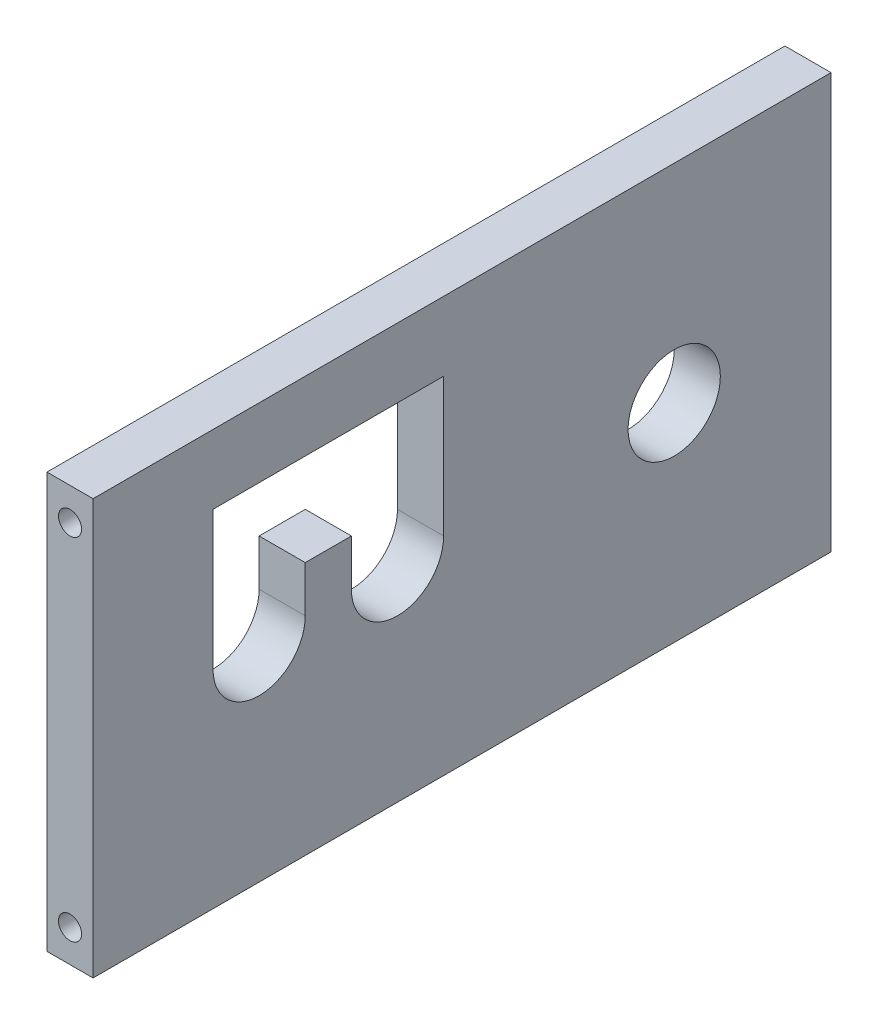
ISO-10303-21;
HEADER;
FILE_DESCRIPTION(('STEP AP214'),'2;1');
FILE_NAME('part.step','',(''),(''),'','','');
FILE_SCHEMA(('AUTOMOTIVE_DESIGN { 1 0 10303 214 1 1 1 1 }'));
ENDSEC;
DATA;
#1=APPLICATION_CONTEXT('core data for automotive mechanical design processes');
#2=APPLICATION_PROTOCOL_DEFINITION('international standard','automotive_design',2000,#1);
#3=PRODUCT_CONTEXT('',#1,'mechanical');
#4=PRODUCT('Part','Part','',(#3));
#5=PRODUCT_RELATED_PRODUCT_CATEGORY('part','',(#4));
#6=PRODUCT_DEFINITION_FORMATION('','',#4);
#7=PRODUCT_DEFINITION_CONTEXT('part definition',#1,'design');
#8=PRODUCT_DEFINITION('design','',#6,#7);
#9=PRODUCT_DEFINITION_SHAPE('','',#8);
#10=(LENGTH_UNIT() NAMED_UNIT(*) SI_UNIT(.MILLI.,.METRE.));
#11=(NAMED_UNIT(*) PLANE_ANGLE_UNIT() SI_UNIT($,.RADIAN.));
#12=(NAMED_UNIT(*) SI_UNIT($,.STERADIAN.) SOLID_ANGLE_UNIT());
#13=UNCERTAINTY_MEASURE_WITH_UNIT(LENGTH_MEASURE(1.E-05),#10,'distance_accuracy_value','');
#14=(GEOMETRIC_REPRESENTATION_CONTEXT(3) GLOBAL_UNCERTAINTY_ASSIGNED_CONTEXT((#13)) GLOBAL_UNIT_ASSIGNED_CONTEXT((#10,
#11,#12)) REPRESENTATION_CONTEXT('',''));
#15=CARTESIAN_POINT('',(0.,0.,0.));
#16=DIRECTION('',(0.,0.,1.));
#17=DIRECTION('',(1.,0.,0.));
#18=AXIS2_PLACEMENT_3D('',#15,#16,#17);
#19=CARTESIAN_POINT('',(-10.,0.,22.));
#20=DIRECTION('',(1.,0.,0.));
#21=DIRECTION('',(0.,0.,-1.));
#22=AXIS2_PLACEMENT_3D('',#19,#20,#21);
#23=CYLINDRICAL_SURFACE('',#22,5.);
#24=DIRECTION('',(1.,0.,0.));
#25=VECTOR('',#24,1.);
#26=CARTESIAN_POINT('',(-10.,0.,27.));
#27=LINE('',#26,#25);
#28=CARTESIAN_POINT('',(0.,0.,27.));
#29=VERTEX_POINT('',#28);
#30=CARTESIAN_POINT('',(-5.,0.,27.));
#31=VERTEX_POINT('',#30);
#32=EDGE_CURVE('E146',#29,#31,#27,.F.);
#33=ORIENTED_EDGE('',*,*,#32,.F.);
#34=CARTESIAN_POINT('',(0.,0.,22.));
#35=DIRECTION('',(1.,0.,0.));
#36=DIRECTION('',(0.,0.,-1.));
#37=AXIS2_PLACEMENT_3D('',#34,#35,#36);
#38=CIRCLE('',#37,5.);
#39=CARTESIAN_POINT('',(0.,0.,17.));
#40=VERTEX_POINT('',#39);
#41=EDGE_CURVE('E153',#29,#40,#38,.T.);
#42=ORIENTED_EDGE('',*,*,#41,.T.);
#43=DIRECTION('',(1.,0.,0.));
#44=VECTOR('',#43,1.);
#45=CARTESIAN_POINT('',(-10.,0.,17.));
#46=LINE('',#45,#44);
#47=CARTESIAN_POINT('',(-5.,0.,17.));
#48=VERTEX_POINT('',#47);
#49=EDGE_CURVE('E137',#40,#48,#46,.F.);
#50=ORIENTED_EDGE('',*,*,#49,.T.);
#51=CARTESIAN_POINT('',(-5.,0.,22.));
#52=DIRECTION('',(1.,0.,0.));
#53=DIRECTION('',(0.,0.,-1.));
#54=AXIS2_PLACEMENT_3D('',#51,#52,#53);
#55=CIRCLE('',#54,5.);
#56=EDGE_CURVE('E176',#31,#48,#55,.T.);
#57=ORIENTED_EDGE('',*,*,#56,.F.);
#58=EDGE_LOOP('',(#33,#42,#50,#57));
#59=FACE_BOUND('',#58,.T.);
#60=ADVANCED_FACE('F37',(#59),#23,.F.);
#61=CARTESIAN_POINT('',(-5.,22.5,40.));
#62=DIRECTION('',(0.,0.,1.));
#63=DIRECTION('',(1.,0.,0.));
#64=AXIS2_PLACEMENT_3D('',#61,#62,#63);
#65=PLANE('',#64);
#66=CARTESIAN_POINT('',(-2.5,19.,40.));
#67=DIRECTION('',(0.,0.,1.));
#68=DIRECTION('',(1.,0.,0.));
#69=AXIS2_PLACEMENT_3D('',#66,#67,#68);
#70=CIRCLE('',#69,1.24999999999999);
#71=CARTESIAN_POINT('',(-1.25000000000001,19.,40.));
#72=VERTEX_POINT('',#71);
#73=EDGE_CURVE('E190',#72,#72,#70,.T.);
#74=ORIENTED_EDGE('',*,*,#73,.F.);
#75=EDGE_LOOP('',(#74));
#76=FACE_BOUND('',#75,.T.);
#77=CARTESIAN_POINT('',(-2.5,-19.,40.));
#78=DIRECTION('',(0.,0.,1.));
#79=DIRECTION('',(1.,0.,0.));
#80=AXIS2_PLACEMENT_3D('',#77,#78,#79);
#81=CIRCLE('',#80,1.24999999999999);
#82=CARTESIAN_POINT('',(-1.25000000000001,-19.,40.));
#83=VERTEX_POINT('',#82);
#84=EDGE_CURVE('E196',#83,#83,#81,.T.);
#85=ORIENTED_EDGE('',*,*,#84,.F.);
#86=EDGE_LOOP('',(#85));
#87=FACE_BOUND('',#86,.T.);
#88=DIRECTION('',(0.,-1.,0.));
#89=VECTOR('',#88,1.);
#90=CARTESIAN_POINT('',(0.,22.5,40.));
#91=LINE('',#90,#89);
#92=CARTESIAN_POINT('',(0.,22.5,40.));
#93=VERTEX_POINT('',#92);
#94=CARTESIAN_POINT('',(0.,-22.5,40.));
#95=VERTEX_POINT('',#94);
#96=EDGE_CURVE('E202',#93,#95,#91,.T.);
#97=ORIENTED_EDGE('',*,*,#96,.F.);
#98=DIRECTION('',(1.,0.,0.));
#99=VECTOR('',#98,1.);
#100=CARTESIAN_POINT('',(-5.,22.5,40.));
#101=LINE('',#100,#99);
#102=CARTESIAN_POINT('',(-5.,22.5,40.));
#103=VERTEX_POINT('',#102);
#104=EDGE_CURVE('E147',#103,#93,#101,.T.);
#105=ORIENTED_EDGE('',*,*,#104,.F.);
#106=DIRECTION('',(0.,-1.,0.));
#107=VECTOR('',#106,1.);
#108=CARTESIAN_POINT('',(-5.,22.5,40.));
#109=LINE('',#108,#107);
#110=CARTESIAN_POINT('',(-5.,-22.5,40.));
#111=VERTEX_POINT('',#110);
#112=EDGE_CURVE('E203',#103,#111,#109,.T.);
#113=ORIENTED_EDGE('',*,*,#112,.T.);
#114=DIRECTION('',(1.,0.,0.));
#115=VECTOR('',#114,1.);
#116=CARTESIAN_POINT('',(-5.,-22.5,40.));
#117=LINE('',#116,#115);
#118=EDGE_CURVE('E214',#111,#95,#117,.T.);
#119=ORIENTED_EDGE('',*,*,#118,.T.);
#120=EDGE_LOOP('',(#97,#105,#113,#119));
#121=FACE_BOUND('',#120,.T.);
#122=ADVANCED_FACE('F39',(#76,#87,#121),#65,.T.);
#123=CARTESIAN_POINT('',(-5.,22.5,40.));
#124=DIRECTION('',(0.,-1.,0.));
#125=DIRECTION('',(0.,0.,-1.));
#126=AXIS2_PLACEMENT_3D('',#123,#124,#125);
#127=PLANE('',#126);
#128=DIRECTION('',(0.,0.,-1.));
#129=VECTOR('',#128,1.);
#130=CARTESIAN_POINT('',(0.,22.5,40.));
#131=LINE('',#130,#129);
#132=CARTESIAN_POINT('',(0.,22.5,-40.));
#133=VERTEX_POINT('',#132);
#134=EDGE_CURVE('E207',#93,#133,#131,.T.);
#135=ORIENTED_EDGE('',*,*,#134,.T.);
#136=DIRECTION('',(1.,0.,0.));
#137=VECTOR('',#136,1.);
#138=CARTESIAN_POINT('',(-5.,22.5,-40.));
#139=LINE('',#138,#137);
#140=CARTESIAN_POINT('',(-5.,22.5,-40.));
#141=VERTEX_POINT('',#140);
#142=EDGE_CURVE('E225',#141,#133,#139,.T.);
#143=ORIENTED_EDGE('',*,*,#142,.F.);
#144=DIRECTION('',(0.,0.,-1.));
#145=VECTOR('',#144,1.);
#146=CARTESIAN_POINT('',(-5.,22.5,40.));
#147=LINE('',#146,#145);
#148=EDGE_CURVE('E212',#103,#141,#147,.T.);
#149=ORIENTED_EDGE('',*,*,#148,.F.);
#150=ORIENTED_EDGE('',*,*,#104,.T.);
#151=EDGE_LOOP('',(#135,#143,#149,#150));
#152=FACE_BOUND('',#151,.T.);
#153=ADVANCED_FACE('F293',(#152),#127,.F.);
#154=CARTESIAN_POINT('',(-5.,22.5,-40.));
#155=DIRECTION('',(0.,0.,1.));
#156=DIRECTION('',(1.,0.,0.));
#157=AXIS2_PLACEMENT_3D('',#154,#155,#156);
#158=PLANE('',#157);
#159=CARTESIAN_POINT('',(-2.5,19.,-40.));
#160=DIRECTION('',(0.,0.,-1.));
#161=DIRECTION('',(-1.,0.,0.));
#162=AXIS2_PLACEMENT_3D('',#159,#160,#161);
#163=CIRCLE('',#162,1.24999999999999);
#164=CARTESIAN_POINT('',(-3.74999999999999,19.,-40.));
#165=VERTEX_POINT('',#164);
#166=EDGE_CURVE('E178',#165,#165,#163,.T.);
#167=ORIENTED_EDGE('',*,*,#166,.F.);
#168=EDGE_LOOP('',(#167));
#169=FACE_BOUND('',#168,.T.);
#170=CARTESIAN_POINT('',(-2.5,-19.,-40.));
#171=DIRECTION('',(0.,0.,-1.));
#172=DIRECTION('',(-1.,0.,0.));
#173=AXIS2_PLACEMENT_3D('',#170,#171,#172);
#174=CIRCLE('',#173,1.24999999999999);
#175=CARTESIAN_POINT('',(-3.74999999999999,-19.,-40.));
#176=VERTEX_POINT('',#175);
#177=EDGE_CURVE('E184',#176,#176,#174,.T.);
#178=ORIENTED_EDGE('',*,*,#177,.F.);
#179=EDGE_LOOP('',(#178));
#180=FACE_BOUND('',#179,.T.);
#181=DIRECTION('',(0.,-1.,0.));
#182=VECTOR('',#181,1.);
#183=CARTESIAN_POINT('',(0.,22.5,-40.));
#184=LINE('',#183,#182);
#185=CARTESIAN_POINT('',(0.,-22.5,-40.));
#186=VERTEX_POINT('',#185);
#187=EDGE_CURVE('E220',#133,#186,#184,.T.);
#188=ORIENTED_EDGE('',*,*,#187,.T.);
#189=DIRECTION('',(1.,0.,0.));
#190=VECTOR('',#189,1.);
#191=CARTESIAN_POINT('',(-5.,-22.5,-40.));
#192=LINE('',#191,#190);
#193=CARTESIAN_POINT('',(-5.,-22.5,-40.));
#194=VERTEX_POINT('',#193);
#195=EDGE_CURVE('E228',#194,#186,#192,.T.);
#196=ORIENTED_EDGE('',*,*,#195,.F.);
#197=DIRECTION('',(0.,-1.,0.));
#198=VECTOR('',#197,1.);
#199=CARTESIAN_POINT('',(-5.,22.5,-40.));
#200=LINE('',#199,#198);
#201=EDGE_CURVE('E210',#141,#194,#200,.T.);
#202=ORIENTED_EDGE('',*,*,#201,.F.);
#203=ORIENTED_EDGE('',*,*,#142,.T.);
#204=EDGE_LOOP('',(#188,#196,#202,#203));
#205=FACE_BOUND('',#204,.T.);
#206=ADVANCED_FACE('F340',(#169,#180,#205),#158,.F.);
#207=CARTESIAN_POINT('',(-5.,-22.5,40.));
#208=DIRECTION('',(0.,-1.,0.));
#209=DIRECTION('',(0.,0.,-1.));
#210=AXIS2_PLACEMENT_3D('',#207,#208,#209);
#211=PLANE('',#210);
#212=DIRECTION('',(0.,0.,-1.));
#213=VECTOR('',#212,1.);
#214=CARTESIAN_POINT('',(0.,-22.5,40.));
#215=LINE('',#214,#213);
#216=EDGE_CURVE('E217',#95,#186,#215,.T.);
#217=ORIENTED_EDGE('',*,*,#216,.F.);
#218=ORIENTED_EDGE('',*,*,#118,.F.);
#219=DIRECTION('',(0.,0.,-1.));
#220=VECTOR('',#219,1.);
#221=CARTESIAN_POINT('',(-5.,-22.5,40.));
#222=LINE('',#221,#220);
#223=EDGE_CURVE('E206',#111,#194,#222,.T.);
#224=ORIENTED_EDGE('',*,*,#223,.T.);
#225=ORIENTED_EDGE('',*,*,#195,.T.);
#226=EDGE_LOOP('',(#217,#218,#224,#225));
#227=FACE_BOUND('',#226,.T.);
#228=ADVANCED_FACE('F335',(#227),#211,.T.);
#229=CARTESIAN_POINT('',(-5.,0.,0.));
#230=DIRECTION('',(1.,0.,0.));
#231=DIRECTION('',(0.,0.,-1.));
#232=AXIS2_PLACEMENT_3D('',#229,#230,#231);
#233=PLANE('',#232);
#234=DIRECTION('',(0.,0.,1.));
#235=VECTOR('',#234,1.);
#236=CARTESIAN_POINT('',(-5.,15.,0.));
#237=LINE('',#236,#235);
#238=CARTESIAN_POINT('',(-5.,15.,2.));
#239=VERTEX_POINT('',#238);
#240=CARTESIAN_POINT('',(-5.,15.,27.));
#241=VERTEX_POINT('',#240);
#242=EDGE_CURVE('E159',#239,#241,#237,.T.);
#243=ORIENTED_EDGE('',*,*,#242,.T.);
#244=DIRECTION('',(0.,-1.,0.));
#245=VECTOR('',#244,1.);
#246=CARTESIAN_POINT('',(-5.,0.,27.));
#247=LINE('',#246,#245);
#248=EDGE_CURVE('E247',#241,#31,#247,.T.);
#249=ORIENTED_EDGE('',*,*,#248,.T.);
#250=ORIENTED_EDGE('',*,*,#56,.T.);
#251=DIRECTION('',(0.,1.,0.));
#252=VECTOR('',#251,1.);
#253=CARTESIAN_POINT('',(-5.,0.,17.));
#254=LINE('',#253,#252);
#255=CARTESIAN_POINT('',(-5.,5.,17.));
#256=VERTEX_POINT('',#255);
#257=EDGE_CURVE('E52',#48,#256,#254,.T.);
#258=ORIENTED_EDGE('',*,*,#257,.T.);
#259=DIRECTION('',(0.,0.,-1.));
#260=VECTOR('',#259,1.);
#261=CARTESIAN_POINT('',(-5.,5.,0.));
#262=LINE('',#261,#260);
#263=CARTESIAN_POINT('',(-5.,5.,12.));
#264=VERTEX_POINT('',#263);
#265=EDGE_CURVE('E165',#256,#264,#262,.T.);
#266=ORIENTED_EDGE('',*,*,#265,.T.);
#267=DIRECTION('',(0.,-1.,0.));
#268=VECTOR('',#267,1.);
#269=CARTESIAN_POINT('',(-5.,0.,12.));
#270=LINE('',#269,#268);
#271=CARTESIAN_POINT('',(-5.,0.,12.));
#272=VERTEX_POINT('',#271);
#273=EDGE_CURVE('E235',#264,#272,#270,.T.);
#274=ORIENTED_EDGE('',*,*,#273,.T.);
#275=CARTESIAN_POINT('',(-5.,0.,7.));
#276=DIRECTION('',(1.,0.,0.));
#277=DIRECTION('',(0.,0.,-1.));
#278=AXIS2_PLACEMENT_3D('',#275,#276,#277);
#279=CIRCLE('',#278,5.);
#280=CARTESIAN_POINT('',(-5.,0.,2.));
#281=VERTEX_POINT('',#280);
#282=EDGE_CURVE('E170',#272,#281,#279,.T.);
#283=ORIENTED_EDGE('',*,*,#282,.T.);
#284=DIRECTION('',(0.,1.,0.));
#285=VECTOR('',#284,1.);
#286=CARTESIAN_POINT('',(-5.,0.,2.));
#287=LINE('',#286,#285);
#288=EDGE_CURVE('E246',#281,#239,#287,.T.);
#289=ORIENTED_EDGE('',*,*,#288,.T.);
#290=EDGE_LOOP('',(#243,#249,#250,#258,#266,#274,#283,#289));
#291=FACE_BOUND('',#290,.T.);
#292=CARTESIAN_POINT('',(-5.,0.,-23.));
#293=DIRECTION('',(1.,0.,0.));
#294=DIRECTION('',(0.,0.,-1.));
#295=AXIS2_PLACEMENT_3D('',#292,#293,#294);
#296=CIRCLE('',#295,5.);
#297=CARTESIAN_POINT('',(-5.,0.,-28.));
#298=VERTEX_POINT('',#297);
#299=EDGE_CURVE('E173',#298,#298,#296,.T.);
#300=ORIENTED_EDGE('',*,*,#299,.T.);
#301=EDGE_LOOP('',(#300));
#302=FACE_BOUND('',#301,.T.);
#303=ORIENTED_EDGE('',*,*,#112,.F.);
#304=ORIENTED_EDGE('',*,*,#148,.T.);
#305=ORIENTED_EDGE('',*,*,#201,.T.);
#306=ORIENTED_EDGE('',*,*,#223,.F.);
#307=EDGE_LOOP('',(#303,#304,#305,#306));
#308=FACE_BOUND('',#307,.T.);
#309=ADVANCED_FACE('F243',(#291,#302,#308),#233,.F.);
#310=CARTESIAN_POINT('',(0.,0.,0.));
#311=DIRECTION('',(1.,0.,0.));
#312=DIRECTION('',(0.,0.,-1.));
#313=AXIS2_PLACEMENT_3D('',#310,#311,#312);
#314=PLANE('',#313);
#315=DIRECTION('',(0.,-1.,0.));
#316=VECTOR('',#315,1.);
#317=CARTESIAN_POINT('',(0.,0.,27.));
#318=LINE('',#317,#316);
#319=CARTESIAN_POINT('',(0.,15.,27.));
#320=VERTEX_POINT('',#319);
#321=EDGE_CURVE('E60',#320,#29,#318,.T.);
#322=ORIENTED_EDGE('',*,*,#321,.F.);
#323=DIRECTION('',(0.,0.,1.));
#324=VECTOR('',#323,1.);
#325=CARTESIAN_POINT('',(0.,15.,27.));
#326=LINE('',#325,#324);
#327=CARTESIAN_POINT('',(0.,15.,2.));
#328=VERTEX_POINT('',#327);
#329=EDGE_CURVE('E258',#328,#320,#326,.T.);
#330=ORIENTED_EDGE('',*,*,#329,.F.);
#331=DIRECTION('',(0.,1.,0.));
#332=VECTOR('',#331,1.);
#333=CARTESIAN_POINT('',(0.,0.,2.));
#334=LINE('',#333,#332);
#335=CARTESIAN_POINT('',(0.,0.,2.));
#336=VERTEX_POINT('',#335);
#337=EDGE_CURVE('E255',#336,#328,#334,.T.);
#338=ORIENTED_EDGE('',*,*,#337,.F.);
#339=CARTESIAN_POINT('',(0.,0.,7.));
#340=DIRECTION('',(1.,0.,0.));
#341=DIRECTION('',(0.,0.,-1.));
#342=AXIS2_PLACEMENT_3D('',#339,#340,#341);
#343=CIRCLE('',#342,5.);
#344=CARTESIAN_POINT('',(0.,0.,12.));
#345=VERTEX_POINT('',#344);
#346=EDGE_CURVE('E162',#345,#336,#343,.T.);
#347=ORIENTED_EDGE('',*,*,#346,.F.);
#348=DIRECTION('',(0.,-1.,0.));
#349=VECTOR('',#348,1.);
#350=CARTESIAN_POINT('',(0.,0.,12.));
#351=LINE('',#350,#349);
#352=CARTESIAN_POINT('',(0.,5.,12.));
#353=VERTEX_POINT('',#352);
#354=EDGE_CURVE('E237',#353,#345,#351,.T.);
#355=ORIENTED_EDGE('',*,*,#354,.F.);
#356=DIRECTION('',(0.,0.,-1.));
#357=VECTOR('',#356,1.);
#358=CARTESIAN_POINT('',(0.,5.,12.));
#359=LINE('',#358,#357);
#360=CARTESIAN_POINT('',(0.,5.,17.));
#361=VERTEX_POINT('',#360);
#362=EDGE_CURVE('E156',#361,#353,#359,.T.);
#363=ORIENTED_EDGE('',*,*,#362,.F.);
#364=DIRECTION('',(0.,1.,0.));
#365=VECTOR('',#364,1.);
#366=CARTESIAN_POINT('',(0.,0.,17.));
#367=LINE('',#366,#365);
#368=EDGE_CURVE('E140',#40,#361,#367,.T.);
#369=ORIENTED_EDGE('',*,*,#368,.F.);
#370=ORIENTED_EDGE('',*,*,#41,.F.);
#371=EDGE_LOOP('',(#322,#330,#338,#347,#355,#363,#369,#370));
#372=FACE_BOUND('',#371,.T.);
#373=CARTESIAN_POINT('',(0.,0.,-23.));
#374=DIRECTION('',(1.,0.,0.));
#375=DIRECTION('',(0.,0.,-1.));
#376=AXIS2_PLACEMENT_3D('',#373,#374,#375);
#377=CIRCLE('',#376,5.);
#378=CARTESIAN_POINT('',(0.,0.,-28.));
#379=VERTEX_POINT('',#378);
#380=EDGE_CURVE('E158',#379,#379,#377,.T.);
#381=ORIENTED_EDGE('',*,*,#380,.F.);
#382=EDGE_LOOP('',(#381));
#383=FACE_BOUND('',#382,.T.);
#384=ORIENTED_EDGE('',*,*,#96,.T.);
#385=ORIENTED_EDGE('',*,*,#216,.T.);
#386=ORIENTED_EDGE('',*,*,#187,.F.);
#387=ORIENTED_EDGE('',*,*,#134,.F.);
#388=EDGE_LOOP('',(#384,#385,#386,#387));
#389=FACE_BOUND('',#388,.T.);
#390=ADVANCED_FACE('F151',(#372,#383,#389),#314,.T.);
#391=CARTESIAN_POINT('',(-2.5,-19.,32.5));
#392=DIRECTION('',(0.,0.,1.));
#393=DIRECTION('',(1.,0.,0.));
#394=AXIS2_PLACEMENT_3D('',#391,#392,#393);
#395=CONICAL_SURFACE('',#394,1.24999999999999,1.02974425867665);
#396=CARTESIAN_POINT('',(-2.5,-19.,31.7489242262155));
#397=VERTEX_POINT('',#396);
#398=VERTEX_LOOP('',#397);
#399=FACE_BOUND('',#398,.T.);
#400=CARTESIAN_POINT('',(-2.5,-19.,32.5));
#401=DIRECTION('',(0.,0.,1.));
#402=DIRECTION('',(1.,0.,0.));
#403=AXIS2_PLACEMENT_3D('',#400,#401,#402);
#404=CIRCLE('',#403,1.24999999999999);
#405=CARTESIAN_POINT('',(-1.25000000000001,-19.,32.5));
#406=VERTEX_POINT('',#405);
#407=EDGE_CURVE('E199',#406,#406,#404,.T.);
#408=ORIENTED_EDGE('',*,*,#407,.T.);
#409=EDGE_LOOP('',(#408));
#410=FACE_BOUND('',#409,.T.);
#411=ADVANCED_FACE('F328',(#399,#410),#395,.F.);
#412=CARTESIAN_POINT('',(-2.5,-19.,40.));
#413=DIRECTION('',(0.,0.,1.));
#414=DIRECTION('',(1.,0.,0.));
#415=AXIS2_PLACEMENT_3D('',#412,#413,#414);
#416=CYLINDRICAL_SURFACE('',#415,1.24999999999999);
#417=ORIENTED_EDGE('',*,*,#407,.F.);
#418=EDGE_LOOP('',(#417));
#419=FACE_BOUND('',#418,.T.);
#420=ORIENTED_EDGE('',*,*,#84,.T.);
#421=EDGE_LOOP('',(#420));
#422=FACE_BOUND('',#421,.T.);
#423=ADVANCED_FACE('F324',(#419,#422),#416,.F.);
#424=CARTESIAN_POINT('',(-2.5,19.,32.5));
#425=DIRECTION('',(0.,0.,1.));
#426=DIRECTION('',(1.,0.,0.));
#427=AXIS2_PLACEMENT_3D('',#424,#425,#426);
#428=CONICAL_SURFACE('',#427,1.24999999999999,1.02974425867665);
#429=CARTESIAN_POINT('',(-2.5,19.,31.7489242262155));
#430=VERTEX_POINT('',#429);
#431=VERTEX_LOOP('',#430);
#432=FACE_BOUND('',#431,.T.);
#433=CARTESIAN_POINT('',(-2.5,19.,32.5));
#434=DIRECTION('',(0.,0.,1.));
#435=DIRECTION('',(1.,0.,0.));
#436=AXIS2_PLACEMENT_3D('',#433,#434,#435);
#437=CIRCLE('',#436,1.24999999999999);
#438=CARTESIAN_POINT('',(-1.25000000000001,19.,32.5));
#439=VERTEX_POINT('',#438);
#440=EDGE_CURVE('E193',#439,#439,#437,.T.);
#441=ORIENTED_EDGE('',*,*,#440,.T.);
#442=EDGE_LOOP('',(#441));
#443=FACE_BOUND('',#442,.T.);
#444=ADVANCED_FACE('F320',(#432,#443),#428,.F.);
#445=CARTESIAN_POINT('',(-2.5,19.,40.));
#446=DIRECTION('',(0.,0.,1.));
#447=DIRECTION('',(1.,0.,0.));
#448=AXIS2_PLACEMENT_3D('',#445,#446,#447);
#449=CYLINDRICAL_SURFACE('',#448,1.24999999999999);
#450=ORIENTED_EDGE('',*,*,#440,.F.);
#451=EDGE_LOOP('',(#450));
#452=FACE_BOUND('',#451,.T.);
#453=ORIENTED_EDGE('',*,*,#73,.T.);
#454=EDGE_LOOP('',(#453));
#455=FACE_BOUND('',#454,.T.);
#456=ADVANCED_FACE('F316',(#452,#455),#449,.F.);
#457=CARTESIAN_POINT('',(-2.5,-19.,-32.5));
#458=DIRECTION('',(0.,0.,-1.));
#459=DIRECTION('',(-1.,0.,0.));
#460=AXIS2_PLACEMENT_3D('',#457,#458,#459);
#461=CONICAL_SURFACE('',#460,1.24999999999999,1.02974425867665);
#462=CARTESIAN_POINT('',(-2.5,-19.,-31.7489242262155));
#463=VERTEX_POINT('',#462);
#464=VERTEX_LOOP('',#463);
#465=FACE_BOUND('',#464,.T.);
#466=CARTESIAN_POINT('',(-2.5,-19.,-32.5));
#467=DIRECTION('',(0.,0.,-1.));
#468=DIRECTION('',(-1.,0.,0.));
#469=AXIS2_PLACEMENT_3D('',#466,#467,#468);
#470=CIRCLE('',#469,1.24999999999999);
#471=CARTESIAN_POINT('',(-3.74999999999999,-19.,-32.5));
#472=VERTEX_POINT('',#471);
#473=EDGE_CURVE('E187',#472,#472,#470,.T.);
#474=ORIENTED_EDGE('',*,*,#473,.T.);
#475=EDGE_LOOP('',(#474));
#476=FACE_BOUND('',#475,.T.);
#477=ADVANCED_FACE('F312',(#465,#476),#461,.F.);
#478=CARTESIAN_POINT('',(-2.5,-19.,-40.));
#479=DIRECTION('',(0.,0.,-1.));
#480=DIRECTION('',(-1.,0.,0.));
#481=AXIS2_PLACEMENT_3D('',#478,#479,#480);
#482=CYLINDRICAL_SURFACE('',#481,1.24999999999999);
#483=ORIENTED_EDGE('',*,*,#473,.F.);
#484=EDGE_LOOP('',(#483));
#485=FACE_BOUND('',#484,.T.);
#486=ORIENTED_EDGE('',*,*,#177,.T.);
#487=EDGE_LOOP('',(#486));
#488=FACE_BOUND('',#487,.T.);
#489=ADVANCED_FACE('F308',(#485,#488),#482,.F.);
#490=CARTESIAN_POINT('',(-2.5,19.,-32.5));
#491=DIRECTION('',(0.,0.,-1.));
#492=DIRECTION('',(-1.,0.,0.));
#493=AXIS2_PLACEMENT_3D('',#490,#491,#492);
#494=CONICAL_SURFACE('',#493,1.24999999999999,1.02974425867665);
#495=CARTESIAN_POINT('',(-2.5,19.,-31.7489242262155));
#496=VERTEX_POINT('',#495);
#497=VERTEX_LOOP('',#496);
#498=FACE_BOUND('',#497,.T.);
#499=CARTESIAN_POINT('',(-2.5,19.,-32.5));
#500=DIRECTION('',(0.,0.,-1.));
#501=DIRECTION('',(-1.,0.,0.));
#502=AXIS2_PLACEMENT_3D('',#499,#500,#501);
#503=CIRCLE('',#502,1.24999999999999);
#504=CARTESIAN_POINT('',(-3.74999999999999,19.,-32.5));
#505=VERTEX_POINT('',#504);
#506=EDGE_CURVE('E181',#505,#505,#503,.T.);
#507=ORIENTED_EDGE('',*,*,#506,.T.);
#508=EDGE_LOOP('',(#507));
#509=FACE_BOUND('',#508,.T.);
#510=ADVANCED_FACE('F304',(#498,#509),#494,.F.);
#511=CARTESIAN_POINT('',(-2.5,19.,-40.));
#512=DIRECTION('',(0.,0.,-1.));
#513=DIRECTION('',(-1.,0.,0.));
#514=AXIS2_PLACEMENT_3D('',#511,#512,#513);
#515=CYLINDRICAL_SURFACE('',#514,1.24999999999999);
#516=ORIENTED_EDGE('',*,*,#506,.F.);
#517=EDGE_LOOP('',(#516));
#518=FACE_BOUND('',#517,.T.);
#519=ORIENTED_EDGE('',*,*,#166,.T.);
#520=EDGE_LOOP('',(#519));
#521=FACE_BOUND('',#520,.T.);
#522=ADVANCED_FACE('F301',(#518,#521),#515,.F.);
#523=CARTESIAN_POINT('',(-10.,0.,7.));
#524=DIRECTION('',(1.,0.,0.));
#525=DIRECTION('',(0.,0.,-1.));
#526=AXIS2_PLACEMENT_3D('',#523,#524,#525);
#527=CYLINDRICAL_SURFACE('',#526,5.);
#528=ORIENTED_EDGE('',*,*,#346,.T.);
#529=DIRECTION('',(1.,0.,0.));
#530=VECTOR('',#529,1.);
#531=CARTESIAN_POINT('',(-10.,0.,2.));
#532=LINE('',#531,#530);
#533=EDGE_CURVE('E11',#336,#281,#532,.F.);
#534=ORIENTED_EDGE('',*,*,#533,.T.);
#535=ORIENTED_EDGE('',*,*,#282,.F.);
#536=DIRECTION('',(1.,0.,0.));
#537=VECTOR('',#536,1.);
#538=CARTESIAN_POINT('',(-10.,0.,12.));
#539=LINE('',#538,#537);
#540=EDGE_CURVE('E45',#345,#272,#539,.F.);
#541=ORIENTED_EDGE('',*,*,#540,.F.);
#542=EDGE_LOOP('',(#528,#534,#535,#541));
#543=FACE_BOUND('',#542,.T.);
#544=ADVANCED_FACE('F249',(#543),#527,.F.);
#545=CARTESIAN_POINT('',(-10.,0.,-23.));
#546=DIRECTION('',(1.,0.,0.));
#547=DIRECTION('',(0.,0.,-1.));
#548=AXIS2_PLACEMENT_3D('',#545,#546,#547);
#549=CYLINDRICAL_SURFACE('',#548,5.);
#550=ORIENTED_EDGE('',*,*,#380,.T.);
#551=EDGE_LOOP('',(#550));
#552=FACE_BOUND('',#551,.T.);
#553=ORIENTED_EDGE('',*,*,#299,.F.);
#554=EDGE_LOOP('',(#553));
#555=FACE_BOUND('',#554,.T.);
#556=ADVANCED_FACE('F297',(#552,#555),#549,.F.);
#557=CARTESIAN_POINT('',(-10.,0.,12.));
#558=DIRECTION('',(0.,0.,1.));
#559=DIRECTION('',(1.,0.,0.));
#560=AXIS2_PLACEMENT_3D('',#557,#558,#559);
#561=PLANE('',#560);
#562=DIRECTION('',(1.,0.,0.));
#563=VECTOR('',#562,1.);
#564=CARTESIAN_POINT('',(-10.,5.,12.));
#565=LINE('',#564,#563);
#566=EDGE_CURVE('E270',#264,#353,#565,.T.);
#567=ORIENTED_EDGE('',*,*,#566,.T.);
#568=ORIENTED_EDGE('',*,*,#354,.T.);
#569=ORIENTED_EDGE('',*,*,#540,.T.);
#570=ORIENTED_EDGE('',*,*,#273,.F.);
#571=EDGE_LOOP('',(#567,#568,#569,#570));
#572=FACE_BOUND('',#571,.T.);
#573=ADVANCED_FACE('F234',(#572),#561,.F.);
#574=CARTESIAN_POINT('',(-10.,0.,17.));
#575=DIRECTION('',(0.,0.,-1.));
#576=DIRECTION('',(-1.,0.,0.));
#577=AXIS2_PLACEMENT_3D('',#574,#575,#576);
#578=PLANE('',#577);
#579=ORIENTED_EDGE('',*,*,#49,.F.);
#580=ORIENTED_EDGE('',*,*,#368,.T.);
#581=DIRECTION('',(1.,0.,0.));
#582=VECTOR('',#581,1.);
#583=CARTESIAN_POINT('',(-10.,5.,17.));
#584=LINE('',#583,#582);
#585=EDGE_CURVE('E265',#256,#361,#584,.T.);
#586=ORIENTED_EDGE('',*,*,#585,.F.);
#587=ORIENTED_EDGE('',*,*,#257,.F.);
#588=EDGE_LOOP('',(#579,#580,#586,#587));
#589=FACE_BOUND('',#588,.T.);
#590=ADVANCED_FACE('F139',(#589),#578,.F.);
#591=CARTESIAN_POINT('',(-10.,5.,12.));
#592=DIRECTION('',(0.,-1.,0.));
#593=DIRECTION('',(0.,0.,-1.));
#594=AXIS2_PLACEMENT_3D('',#591,#592,#593);
#595=PLANE('',#594);
#596=ORIENTED_EDGE('',*,*,#585,.T.);
#597=ORIENTED_EDGE('',*,*,#362,.T.);
#598=ORIENTED_EDGE('',*,*,#566,.F.);
#599=ORIENTED_EDGE('',*,*,#265,.F.);
#600=EDGE_LOOP('',(#596,#597,#598,#599));
#601=FACE_BOUND('',#600,.T.);
#602=ADVANCED_FACE('F430',(#601),#595,.F.);
#603=CARTESIAN_POINT('',(-10.,15.,27.));
#604=DIRECTION('',(0.,1.,0.));
#605=DIRECTION('',(0.,0.,1.));
#606=AXIS2_PLACEMENT_3D('',#603,#604,#605);
#607=PLANE('',#606);
#608=DIRECTION('',(1.,0.,0.));
#609=VECTOR('',#608,1.);
#610=CARTESIAN_POINT('',(-10.,15.,2.));
#611=LINE('',#610,#609);
#612=EDGE_CURVE('E268',#239,#328,#611,.T.);
#613=ORIENTED_EDGE('',*,*,#612,.T.);
#614=ORIENTED_EDGE('',*,*,#329,.T.);
#615=DIRECTION('',(1.,0.,0.));
#616=VECTOR('',#615,1.);
#617=CARTESIAN_POINT('',(-10.,15.,27.));
#618=LINE('',#617,#616);
#619=EDGE_CURVE('E266',#241,#320,#618,.T.);
#620=ORIENTED_EDGE('',*,*,#619,.F.);
#621=ORIENTED_EDGE('',*,*,#242,.F.);
#622=EDGE_LOOP('',(#613,#614,#620,#621));
#623=FACE_BOUND('',#622,.T.);
#624=ADVANCED_FACE('F279',(#623),#607,.F.);
#625=CARTESIAN_POINT('',(-10.,0.,2.));
#626=DIRECTION('',(0.,0.,-1.));
#627=DIRECTION('',(-1.,0.,0.));
#628=AXIS2_PLACEMENT_3D('',#625,#626,#627);
#629=PLANE('',#628);
#630=ORIENTED_EDGE('',*,*,#533,.F.);
#631=ORIENTED_EDGE('',*,*,#337,.T.);
#632=ORIENTED_EDGE('',*,*,#612,.F.);
#633=ORIENTED_EDGE('',*,*,#288,.F.);
#634=EDGE_LOOP('',(#630,#631,#632,#633));
#635=FACE_BOUND('',#634,.T.);
#636=ADVANCED_FACE('F253',(#635),#629,.F.);
#637=CARTESIAN_POINT('',(-10.,0.,27.));
#638=DIRECTION('',(0.,0.,1.));
#639=DIRECTION('',(1.,0.,0.));
#640=AXIS2_PLACEMENT_3D('',#637,#638,#639);
#641=PLANE('',#640);
#642=ORIENTED_EDGE('',*,*,#619,.T.);
#643=ORIENTED_EDGE('',*,*,#321,.T.);
#644=ORIENTED_EDGE('',*,*,#32,.T.);
#645=ORIENTED_EDGE('',*,*,#248,.F.);
#646=EDGE_LOOP('',(#642,#643,#644,#645));
#647=FACE_BOUND('',#646,.T.);
#648=ADVANCED_FACE('F280',(#647),#641,.F.);
#649=CLOSED_SHELL('',(#60,#122,#153,#206,#228,#309,#390,#411,#423,#444,#456,#477,#489,#510,#522,
#544,#556,#573,#590,#602,#624,#636,#648));
#650=MANIFOLD_SOLID_BREP('B2',#649);
#651=ADVANCED_BREP_SHAPE_REPRESENTATION('',(#18,#650),#14);
#652=SHAPE_DEFINITION_REPRESENTATION(#9,#651);
ENDSEC;
END-ISO-10303-21;
